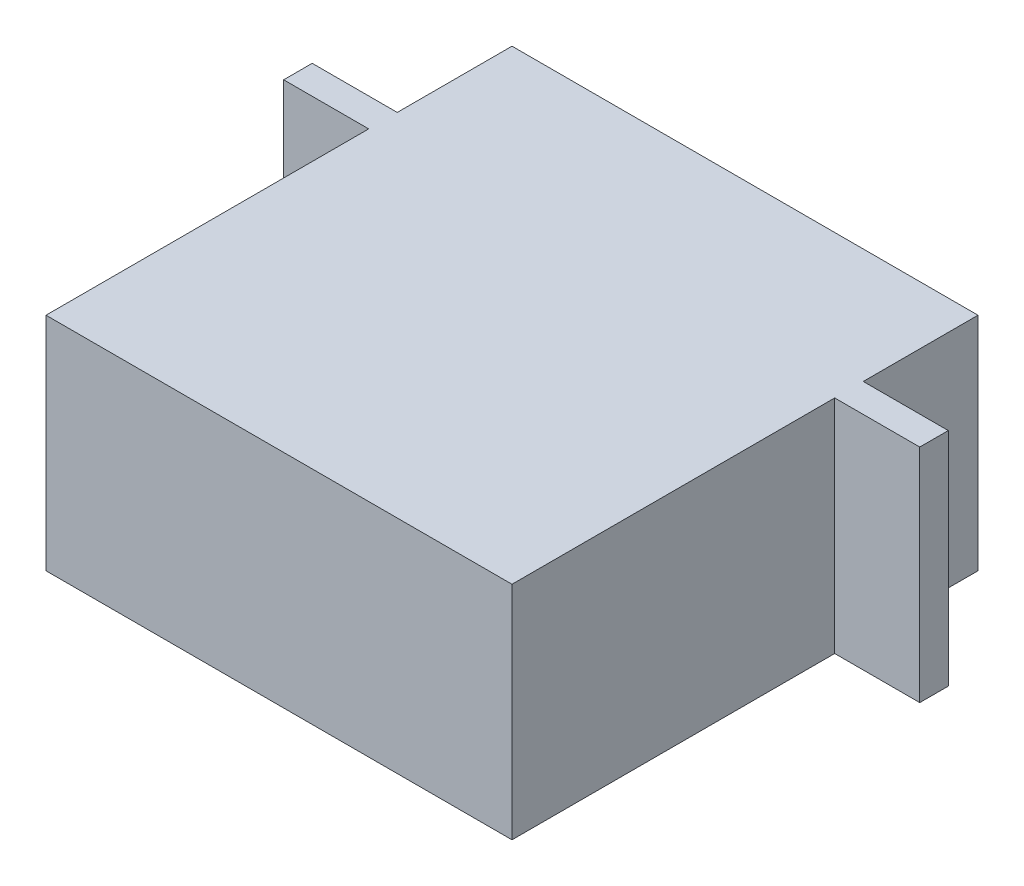
ISO-10303-21;
HEADER;
FILE_DESCRIPTION(('STEP AP214'),'2;1');
FILE_NAME('part.step','',(''),(''),'','','');
FILE_SCHEMA(('AUTOMOTIVE_DESIGN { 1 0 10303 214 1 1 1 1 }'));
ENDSEC;
DATA;
#1=APPLICATION_CONTEXT('core data for automotive mechanical design processes');
#2=APPLICATION_PROTOCOL_DEFINITION('international standard','automotive_design',2000,#1);
#3=PRODUCT_CONTEXT('',#1,'mechanical');
#4=PRODUCT('Part','Part','',(#3));
#5=PRODUCT_RELATED_PRODUCT_CATEGORY('part','',(#4));
#6=PRODUCT_DEFINITION_FORMATION('','',#4);
#7=PRODUCT_DEFINITION_CONTEXT('part definition',#1,'design');
#8=PRODUCT_DEFINITION('design','',#6,#7);
#9=PRODUCT_DEFINITION_SHAPE('','',#8);
#10=(LENGTH_UNIT() NAMED_UNIT(*) SI_UNIT(.MILLI.,.METRE.));
#11=(NAMED_UNIT(*) PLANE_ANGLE_UNIT() SI_UNIT($,.RADIAN.));
#12=(NAMED_UNIT(*) SI_UNIT($,.STERADIAN.) SOLID_ANGLE_UNIT());
#13=UNCERTAINTY_MEASURE_WITH_UNIT(LENGTH_MEASURE(1.E-05),#10,'distance_accuracy_value','');
#14=(GEOMETRIC_REPRESENTATION_CONTEXT(3) GLOBAL_UNCERTAINTY_ASSIGNED_CONTEXT((#13)) GLOBAL_UNIT_ASSIGNED_CONTEXT((#10,
#11,#12)) REPRESENTATION_CONTEXT('',''));
#15=CARTESIAN_POINT('',(0.,0.,0.));
#16=DIRECTION('',(0.,0.,1.));
#17=DIRECTION('',(1.,0.,0.));
#18=AXIS2_PLACEMENT_3D('',#15,#16,#17);
#19=CARTESIAN_POINT('',(-20.,19.,20.));
#20=DIRECTION('',(1.,0.,0.));
#21=DIRECTION('',(0.,0.,-1.));
#22=AXIS2_PLACEMENT_3D('',#19,#20,#21);
#23=PLANE('',#22);
#24=DIRECTION('',(0.,1.,0.));
#25=VECTOR('',#24,1.);
#26=CARTESIAN_POINT('',(-20.,0.,-7.7));
#27=LINE('',#26,#25);
#28=CARTESIAN_POINT('',(-20.,0.,-7.7));
#29=VERTEX_POINT('',#28);
#30=CARTESIAN_POINT('',(-20.,19.,-7.7));
#31=VERTEX_POINT('',#30);
#32=EDGE_CURVE('E152',#29,#31,#27,.T.);
#33=ORIENTED_EDGE('',*,*,#32,.F.);
#34=DIRECTION('',(0.,0.,1.));
#35=VECTOR('',#34,1.);
#36=CARTESIAN_POINT('',(-20.,0.,20.));
#37=LINE('',#36,#35);
#38=CARTESIAN_POINT('',(-20.,0.,20.));
#39=VERTEX_POINT('',#38);
#40=EDGE_CURVE('E203',#29,#39,#37,.T.);
#41=ORIENTED_EDGE('',*,*,#40,.T.);
#42=DIRECTION('',(0.,-1.,0.));
#43=VECTOR('',#42,1.);
#44=CARTESIAN_POINT('',(-20.,19.,20.));
#45=LINE('',#44,#43);
#46=CARTESIAN_POINT('',(-20.,19.,20.));
#47=VERTEX_POINT('',#46);
#48=EDGE_CURVE('E210',#47,#39,#45,.T.);
#49=ORIENTED_EDGE('',*,*,#48,.F.);
#50=DIRECTION('',(0.,0.,1.));
#51=VECTOR('',#50,1.);
#52=CARTESIAN_POINT('',(-20.,19.,20.));
#53=LINE('',#52,#51);
#54=EDGE_CURVE('E55',#31,#47,#53,.T.);
#55=ORIENTED_EDGE('',*,*,#54,.F.);
#56=EDGE_LOOP('',(#33,#41,#49,#55));
#57=FACE_BOUND('',#56,.T.);
#58=ADVANCED_FACE('F40',(#57),#23,.F.);
#59=DIRECTION('',(0.,-1.,0.));
#60=VECTOR('',#59,1.);
#61=CARTESIAN_POINT('',(-20.,0.,-10.15));
#62=LINE('',#61,#60);
#63=CARTESIAN_POINT('',(-20.,19.,-10.15));
#64=VERTEX_POINT('',#63);
#65=CARTESIAN_POINT('',(-20.,0.,-10.15));
#66=VERTEX_POINT('',#65);
#67=EDGE_CURVE('E63',#64,#66,#62,.T.);
#68=ORIENTED_EDGE('',*,*,#67,.F.);
#69=CARTESIAN_POINT('',(-20.,19.,-20.));
#70=VERTEX_POINT('',#69);
#71=EDGE_CURVE('E194',#70,#64,#53,.T.);
#72=ORIENTED_EDGE('',*,*,#71,.F.);
#73=DIRECTION('',(0.,-1.,0.));
#74=VECTOR('',#73,1.);
#75=CARTESIAN_POINT('',(-20.,19.,-20.));
#76=LINE('',#75,#74);
#77=CARTESIAN_POINT('',(-20.,0.,-20.));
#78=VERTEX_POINT('',#77);
#79=EDGE_CURVE('E213',#70,#78,#76,.T.);
#80=ORIENTED_EDGE('',*,*,#79,.T.);
#81=EDGE_CURVE('E204',#78,#66,#37,.T.);
#82=ORIENTED_EDGE('',*,*,#81,.T.);
#83=EDGE_LOOP('',(#68,#72,#80,#82));
#84=FACE_BOUND('',#83,.T.);
#85=ADVANCED_FACE('F231',(#84),#23,.F.);
#86=CARTESIAN_POINT('',(20.,19.,20.));
#87=DIRECTION('',(-1.,0.,0.));
#88=DIRECTION('',(0.,0.,1.));
#89=AXIS2_PLACEMENT_3D('',#86,#87,#88);
#90=PLANE('',#89);
#91=DIRECTION('',(0.,1.,0.));
#92=VECTOR('',#91,1.);
#93=CARTESIAN_POINT('',(20.,0.,-10.15));
#94=LINE('',#93,#92);
#95=CARTESIAN_POINT('',(20.,0.,-10.15));
#96=VERTEX_POINT('',#95);
#97=CARTESIAN_POINT('',(20.,19.,-10.15));
#98=VERTEX_POINT('',#97);
#99=EDGE_CURVE('E153',#96,#98,#94,.T.);
#100=ORIENTED_EDGE('',*,*,#99,.F.);
#101=DIRECTION('',(0.,0.,-1.));
#102=VECTOR('',#101,1.);
#103=CARTESIAN_POINT('',(20.,0.,20.));
#104=LINE('',#103,#102);
#105=CARTESIAN_POINT('',(20.,0.,-20.));
#106=VERTEX_POINT('',#105);
#107=EDGE_CURVE('E188',#96,#106,#104,.T.);
#108=ORIENTED_EDGE('',*,*,#107,.T.);
#109=DIRECTION('',(0.,-1.,0.));
#110=VECTOR('',#109,1.);
#111=CARTESIAN_POINT('',(20.,19.,-20.));
#112=LINE('',#111,#110);
#113=CARTESIAN_POINT('',(20.,19.,-20.));
#114=VERTEX_POINT('',#113);
#115=EDGE_CURVE('E48',#114,#106,#112,.T.);
#116=ORIENTED_EDGE('',*,*,#115,.F.);
#117=DIRECTION('',(0.,0.,-1.));
#118=VECTOR('',#117,1.);
#119=CARTESIAN_POINT('',(20.,19.,20.));
#120=LINE('',#119,#118);
#121=EDGE_CURVE('E192',#98,#114,#120,.T.);
#122=ORIENTED_EDGE('',*,*,#121,.F.);
#123=EDGE_LOOP('',(#100,#108,#116,#122));
#124=FACE_BOUND('',#123,.T.);
#125=ADVANCED_FACE('F42',(#124),#90,.F.);
#126=DIRECTION('',(0.,-1.,0.));
#127=VECTOR('',#126,1.);
#128=CARTESIAN_POINT('',(20.,0.,-7.7));
#129=LINE('',#128,#127);
#130=CARTESIAN_POINT('',(20.,19.,-7.7));
#131=VERTEX_POINT('',#130);
#132=CARTESIAN_POINT('',(20.,0.,-7.7));
#133=VERTEX_POINT('',#132);
#134=EDGE_CURVE('E156',#131,#133,#129,.T.);
#135=ORIENTED_EDGE('',*,*,#134,.F.);
#136=CARTESIAN_POINT('',(20.,19.,20.));
#137=VERTEX_POINT('',#136);
#138=EDGE_CURVE('E189',#137,#131,#120,.T.);
#139=ORIENTED_EDGE('',*,*,#138,.F.);
#140=DIRECTION('',(0.,-1.,0.));
#141=VECTOR('',#140,1.);
#142=CARTESIAN_POINT('',(20.,19.,20.));
#143=LINE('',#142,#141);
#144=CARTESIAN_POINT('',(20.,0.,20.));
#145=VERTEX_POINT('',#144);
#146=EDGE_CURVE('E198',#137,#145,#143,.T.);
#147=ORIENTED_EDGE('',*,*,#146,.T.);
#148=EDGE_CURVE('E199',#145,#133,#104,.T.);
#149=ORIENTED_EDGE('',*,*,#148,.T.);
#150=EDGE_LOOP('',(#135,#139,#147,#149));
#151=FACE_BOUND('',#150,.T.);
#152=ADVANCED_FACE('F260',(#151),#90,.F.);
#153=CARTESIAN_POINT('',(-20.,19.,-20.));
#154=DIRECTION('',(0.,0.,1.));
#155=DIRECTION('',(1.,0.,0.));
#156=AXIS2_PLACEMENT_3D('',#153,#154,#155);
#157=PLANE('',#156);
#158=CARTESIAN_POINT('',(11.,10.,-20.));
#159=DIRECTION('',(0.,0.,1.));
#160=DIRECTION('',(1.,0.,0.));
#161=AXIS2_PLACEMENT_3D('',#158,#159,#160);
#162=CIRCLE('',#161,3.);
#163=CARTESIAN_POINT('',(14.,10.,-20.));
#164=VERTEX_POINT('',#163);
#165=EDGE_CURVE('E11',#164,#164,#162,.F.);
#166=ORIENTED_EDGE('',*,*,#165,.F.);
#167=EDGE_LOOP('',(#166));
#168=FACE_BOUND('',#167,.T.);
#169=DIRECTION('',(-1.,0.,0.));
#170=VECTOR('',#169,1.);
#171=CARTESIAN_POINT('',(-20.,0.,-20.));
#172=LINE('',#171,#170);
#173=EDGE_CURVE('E201',#106,#78,#172,.T.);
#174=ORIENTED_EDGE('',*,*,#173,.T.);
#175=ORIENTED_EDGE('',*,*,#79,.F.);
#176=DIRECTION('',(-1.,0.,0.));
#177=VECTOR('',#176,1.);
#178=CARTESIAN_POINT('',(-20.,19.,-20.));
#179=LINE('',#178,#177);
#180=EDGE_CURVE('E191',#114,#70,#179,.T.);
#181=ORIENTED_EDGE('',*,*,#180,.F.);
#182=ORIENTED_EDGE('',*,*,#115,.T.);
#183=EDGE_LOOP('',(#174,#175,#181,#182));
#184=FACE_BOUND('',#183,.T.);
#185=ADVANCED_FACE('F219',(#168,#184),#157,.F.);
#186=CARTESIAN_POINT('',(-20.,19.,20.));
#187=DIRECTION('',(0.,0.,-1.));
#188=DIRECTION('',(-1.,0.,0.));
#189=AXIS2_PLACEMENT_3D('',#186,#187,#188);
#190=PLANE('',#189);
#191=DIRECTION('',(1.,0.,0.));
#192=VECTOR('',#191,1.);
#193=CARTESIAN_POINT('',(-20.,0.,20.));
#194=LINE('',#193,#192);
#195=EDGE_CURVE('E206',#39,#145,#194,.T.);
#196=ORIENTED_EDGE('',*,*,#195,.T.);
#197=ORIENTED_EDGE('',*,*,#146,.F.);
#198=DIRECTION('',(1.,0.,0.));
#199=VECTOR('',#198,1.);
#200=CARTESIAN_POINT('',(-20.,19.,20.));
#201=LINE('',#200,#199);
#202=EDGE_CURVE('E196',#47,#137,#201,.T.);
#203=ORIENTED_EDGE('',*,*,#202,.F.);
#204=ORIENTED_EDGE('',*,*,#48,.T.);
#205=EDGE_LOOP('',(#196,#197,#203,#204));
#206=FACE_BOUND('',#205,.T.);
#207=ADVANCED_FACE('F244',(#206),#190,.F.);
#208=CARTESIAN_POINT('',(0.,19.,0.));
#209=DIRECTION('',(0.,-1.,0.));
#210=DIRECTION('',(0.,0.,-1.));
#211=AXIS2_PLACEMENT_3D('',#208,#209,#210);
#212=PLANE('',#211);
#213=ORIENTED_EDGE('',*,*,#138,.T.);
#214=DIRECTION('',(-1.,0.,0.));
#215=VECTOR('',#214,1.);
#216=CARTESIAN_POINT('',(27.3,19.,-7.7));
#217=LINE('',#216,#215);
#218=CARTESIAN_POINT('',(27.3,19.,-7.7));
#219=VERTEX_POINT('',#218);
#220=EDGE_CURVE('E179',#219,#131,#217,.T.);
#221=ORIENTED_EDGE('',*,*,#220,.F.);
#222=DIRECTION('',(0.,0.,1.));
#223=VECTOR('',#222,1.);
#224=CARTESIAN_POINT('',(27.3,19.,-7.7));
#225=LINE('',#224,#223);
#226=CARTESIAN_POINT('',(27.3,19.,-10.15));
#227=VERTEX_POINT('',#226);
#228=EDGE_CURVE('E165',#227,#219,#225,.T.);
#229=ORIENTED_EDGE('',*,*,#228,.F.);
#230=DIRECTION('',(-1.,0.,0.));
#231=VECTOR('',#230,1.);
#232=CARTESIAN_POINT('',(27.3,19.,-10.15));
#233=LINE('',#232,#231);
#234=EDGE_CURVE('E182',#227,#98,#233,.T.);
#235=ORIENTED_EDGE('',*,*,#234,.T.);
#236=ORIENTED_EDGE('',*,*,#121,.T.);
#237=ORIENTED_EDGE('',*,*,#180,.T.);
#238=ORIENTED_EDGE('',*,*,#71,.T.);
#239=DIRECTION('',(1.,0.,0.));
#240=VECTOR('',#239,1.);
#241=CARTESIAN_POINT('',(-27.3,19.,-10.15));
#242=LINE('',#241,#240);
#243=CARTESIAN_POINT('',(-27.3,19.,-10.15));
#244=VERTEX_POINT('',#243);
#245=EDGE_CURVE('E137',#244,#64,#242,.T.);
#246=ORIENTED_EDGE('',*,*,#245,.F.);
#247=DIRECTION('',(0.,0.,-1.));
#248=VECTOR('',#247,1.);
#249=CARTESIAN_POINT('',(-27.3,19.,-10.15));
#250=LINE('',#249,#248);
#251=CARTESIAN_POINT('',(-27.3,19.,-7.7));
#252=VERTEX_POINT('',#251);
#253=EDGE_CURVE('E129',#252,#244,#250,.T.);
#254=ORIENTED_EDGE('',*,*,#253,.F.);
#255=DIRECTION('',(1.,0.,0.));
#256=VECTOR('',#255,1.);
#257=CARTESIAN_POINT('',(-27.3,19.,-7.7));
#258=LINE('',#257,#256);
#259=EDGE_CURVE('E134',#252,#31,#258,.T.);
#260=ORIENTED_EDGE('',*,*,#259,.T.);
#261=ORIENTED_EDGE('',*,*,#54,.T.);
#262=ORIENTED_EDGE('',*,*,#202,.T.);
#263=EDGE_LOOP('',(#213,#221,#229,#235,#236,#237,#238,#246,#254,#260,#261,#262));
#264=FACE_BOUND('',#263,.T.);
#265=ADVANCED_FACE('F132',(#264),#212,.F.);
#266=CARTESIAN_POINT('',(0.,0.,0.));
#267=DIRECTION('',(0.,-1.,0.));
#268=DIRECTION('',(0.,0.,-1.));
#269=AXIS2_PLACEMENT_3D('',#266,#267,#268);
#270=PLANE('',#269);
#271=ORIENTED_EDGE('',*,*,#148,.F.);
#272=ORIENTED_EDGE('',*,*,#195,.F.);
#273=ORIENTED_EDGE('',*,*,#40,.F.);
#274=DIRECTION('',(1.,0.,0.));
#275=VECTOR('',#274,1.);
#276=CARTESIAN_POINT('',(-27.3,0.,-7.7));
#277=LINE('',#276,#275);
#278=CARTESIAN_POINT('',(-27.3,0.,-7.7));
#279=VERTEX_POINT('',#278);
#280=EDGE_CURVE('E238',#279,#29,#277,.T.);
#281=ORIENTED_EDGE('',*,*,#280,.F.);
#282=DIRECTION('',(0.,0.,1.));
#283=VECTOR('',#282,1.);
#284=CARTESIAN_POINT('',(-27.3,0.,-10.15));
#285=LINE('',#284,#283);
#286=CARTESIAN_POINT('',(-27.3,0.,-10.15));
#287=VERTEX_POINT('',#286);
#288=EDGE_CURVE('E146',#287,#279,#285,.T.);
#289=ORIENTED_EDGE('',*,*,#288,.F.);
#290=DIRECTION('',(1.,0.,0.));
#291=VECTOR('',#290,1.);
#292=CARTESIAN_POINT('',(-27.3,0.,-10.15));
#293=LINE('',#292,#291);
#294=EDGE_CURVE('E158',#287,#66,#293,.T.);
#295=ORIENTED_EDGE('',*,*,#294,.T.);
#296=ORIENTED_EDGE('',*,*,#81,.F.);
#297=ORIENTED_EDGE('',*,*,#173,.F.);
#298=ORIENTED_EDGE('',*,*,#107,.F.);
#299=DIRECTION('',(-1.,0.,0.));
#300=VECTOR('',#299,1.);
#301=CARTESIAN_POINT('',(27.3,0.,-10.15));
#302=LINE('',#301,#300);
#303=CARTESIAN_POINT('',(27.3,0.,-10.15));
#304=VERTEX_POINT('',#303);
#305=EDGE_CURVE('E170',#304,#96,#302,.T.);
#306=ORIENTED_EDGE('',*,*,#305,.F.);
#307=DIRECTION('',(0.,0.,-1.));
#308=VECTOR('',#307,1.);
#309=CARTESIAN_POINT('',(27.3,0.,-7.7));
#310=LINE('',#309,#308);
#311=CARTESIAN_POINT('',(27.3,0.,-7.7));
#312=VERTEX_POINT('',#311);
#313=EDGE_CURVE('E169',#312,#304,#310,.T.);
#314=ORIENTED_EDGE('',*,*,#313,.F.);
#315=DIRECTION('',(-1.,0.,0.));
#316=VECTOR('',#315,1.);
#317=CARTESIAN_POINT('',(27.3,0.,-7.7));
#318=LINE('',#317,#316);
#319=EDGE_CURVE('E176',#312,#133,#318,.T.);
#320=ORIENTED_EDGE('',*,*,#319,.T.);
#321=EDGE_LOOP('',(#271,#272,#273,#281,#289,#295,#296,#297,#298,#306,#314,#320));
#322=FACE_BOUND('',#321,.T.);
#323=ADVANCED_FACE('F228',(#322),#270,.T.);
#324=CARTESIAN_POINT('',(11.,10.,-24.));
#325=DIRECTION('',(0.,0.,1.));
#326=DIRECTION('',(1.,0.,0.));
#327=AXIS2_PLACEMENT_3D('',#324,#325,#326);
#328=CYLINDRICAL_SURFACE('',#327,3.);
#329=CARTESIAN_POINT('',(11.,10.,-24.));
#330=DIRECTION('',(0.,0.,-1.));
#331=DIRECTION('',(-1.,0.,0.));
#332=AXIS2_PLACEMENT_3D('',#329,#330,#331);
#333=CIRCLE('',#332,3.);
#334=CARTESIAN_POINT('',(8.,10.,-24.));
#335=VERTEX_POINT('',#334);
#336=EDGE_CURVE('E185',#335,#335,#333,.T.);
#337=ORIENTED_EDGE('',*,*,#336,.F.);
#338=EDGE_LOOP('',(#337));
#339=FACE_BOUND('',#338,.T.);
#340=ORIENTED_EDGE('',*,*,#165,.T.);
#341=EDGE_LOOP('',(#340));
#342=FACE_BOUND('',#341,.T.);
#343=ADVANCED_FACE('F279',(#339,#342),#328,.T.);
#344=CARTESIAN_POINT('',(11.,10.,-24.));
#345=DIRECTION('',(0.,0.,-1.));
#346=DIRECTION('',(-1.,0.,0.));
#347=AXIS2_PLACEMENT_3D('',#344,#345,#346);
#348=PLANE('',#347);
#349=ORIENTED_EDGE('',*,*,#336,.T.);
#350=EDGE_LOOP('',(#349));
#351=FACE_BOUND('',#350,.T.);
#352=ADVANCED_FACE('F284',(#351),#348,.T.);
#353=CARTESIAN_POINT('',(27.3,0.,-10.15));
#354=DIRECTION('',(0.,0.,1.));
#355=DIRECTION('',(0.,-1.,0.));
#356=AXIS2_PLACEMENT_3D('',#353,#354,#355);
#357=PLANE('',#356);
#358=ORIENTED_EDGE('',*,*,#99,.T.);
#359=ORIENTED_EDGE('',*,*,#234,.F.);
#360=DIRECTION('',(0.,1.,0.));
#361=VECTOR('',#360,1.);
#362=CARTESIAN_POINT('',(27.3,0.,-10.15));
#363=LINE('',#362,#361);
#364=EDGE_CURVE('E162',#304,#227,#363,.T.);
#365=ORIENTED_EDGE('',*,*,#364,.F.);
#366=ORIENTED_EDGE('',*,*,#305,.T.);
#367=EDGE_LOOP('',(#358,#359,#365,#366));
#368=FACE_BOUND('',#367,.T.);
#369=ADVANCED_FACE('F259',(#368),#357,.F.);
#370=CARTESIAN_POINT('',(27.3,0.,-7.7));
#371=DIRECTION('',(0.,0.,-1.));
#372=DIRECTION('',(-1.,0.,0.));
#373=AXIS2_PLACEMENT_3D('',#370,#371,#372);
#374=PLANE('',#373);
#375=ORIENTED_EDGE('',*,*,#134,.T.);
#376=ORIENTED_EDGE('',*,*,#319,.F.);
#377=DIRECTION('',(0.,-1.,0.));
#378=VECTOR('',#377,1.);
#379=CARTESIAN_POINT('',(27.3,0.,-7.7));
#380=LINE('',#379,#378);
#381=EDGE_CURVE('E167',#219,#312,#380,.T.);
#382=ORIENTED_EDGE('',*,*,#381,.F.);
#383=ORIENTED_EDGE('',*,*,#220,.T.);
#384=EDGE_LOOP('',(#375,#376,#382,#383));
#385=FACE_BOUND('',#384,.T.);
#386=ADVANCED_FACE('F251',(#385),#374,.F.);
#387=CARTESIAN_POINT('',(27.3,0.,0.));
#388=DIRECTION('',(-1.,0.,0.));
#389=DIRECTION('',(0.,0.,1.));
#390=AXIS2_PLACEMENT_3D('',#387,#388,#389);
#391=PLANE('',#390);
#392=ORIENTED_EDGE('',*,*,#364,.T.);
#393=ORIENTED_EDGE('',*,*,#228,.T.);
#394=ORIENTED_EDGE('',*,*,#381,.T.);
#395=ORIENTED_EDGE('',*,*,#313,.T.);
#396=EDGE_LOOP('',(#392,#393,#394,#395));
#397=FACE_BOUND('',#396,.T.);
#398=ADVANCED_FACE('F255',(#397),#391,.F.);
#399=CARTESIAN_POINT('',(-27.3,0.,-7.7));
#400=DIRECTION('',(0.,0.,-1.));
#401=DIRECTION('',(-1.,0.,0.));
#402=AXIS2_PLACEMENT_3D('',#399,#400,#401);
#403=PLANE('',#402);
#404=ORIENTED_EDGE('',*,*,#32,.T.);
#405=ORIENTED_EDGE('',*,*,#259,.F.);
#406=DIRECTION('',(0.,1.,0.));
#407=VECTOR('',#406,1.);
#408=CARTESIAN_POINT('',(-27.3,0.,-7.7));
#409=LINE('',#408,#407);
#410=EDGE_CURVE('E141',#279,#252,#409,.T.);
#411=ORIENTED_EDGE('',*,*,#410,.F.);
#412=ORIENTED_EDGE('',*,*,#280,.T.);
#413=EDGE_LOOP('',(#404,#405,#411,#412));
#414=FACE_BOUND('',#413,.T.);
#415=ADVANCED_FACE('F151',(#414),#403,.F.);
#416=CARTESIAN_POINT('',(-27.3,0.,-10.15));
#417=DIRECTION('',(0.,0.,1.));
#418=DIRECTION('',(1.,0.,0.));
#419=AXIS2_PLACEMENT_3D('',#416,#417,#418);
#420=PLANE('',#419);
#421=ORIENTED_EDGE('',*,*,#67,.T.);
#422=ORIENTED_EDGE('',*,*,#294,.F.);
#423=DIRECTION('',(0.,-1.,0.));
#424=VECTOR('',#423,1.);
#425=CARTESIAN_POINT('',(-27.3,0.,-10.15));
#426=LINE('',#425,#424);
#427=EDGE_CURVE('E140',#244,#287,#426,.T.);
#428=ORIENTED_EDGE('',*,*,#427,.F.);
#429=ORIENTED_EDGE('',*,*,#245,.T.);
#430=EDGE_LOOP('',(#421,#422,#428,#429));
#431=FACE_BOUND('',#430,.T.);
#432=ADVANCED_FACE('F233',(#431),#420,.F.);
#433=CARTESIAN_POINT('',(-27.3,0.,0.));
#434=DIRECTION('',(1.,0.,0.));
#435=DIRECTION('',(0.,0.,-1.));
#436=AXIS2_PLACEMENT_3D('',#433,#434,#435);
#437=PLANE('',#436);
#438=ORIENTED_EDGE('',*,*,#410,.T.);
#439=ORIENTED_EDGE('',*,*,#253,.T.);
#440=ORIENTED_EDGE('',*,*,#427,.T.);
#441=ORIENTED_EDGE('',*,*,#288,.T.);
#442=EDGE_LOOP('',(#438,#439,#440,#441));
#443=FACE_BOUND('',#442,.T.);
#444=ADVANCED_FACE('F144',(#443),#437,.F.);
#445=CLOSED_SHELL('',(#58,#85,#125,#152,#185,#207,#265,#323,#343,#352,#369,#386,#398,#415,#432,#444));
#446=MANIFOLD_SOLID_BREP('B2',#445);
#447=ADVANCED_BREP_SHAPE_REPRESENTATION('',(#18,#446),#14);
#448=SHAPE_DEFINITION_REPRESENTATION(#9,#447);
ENDSEC;
END-ISO-10303-21;
